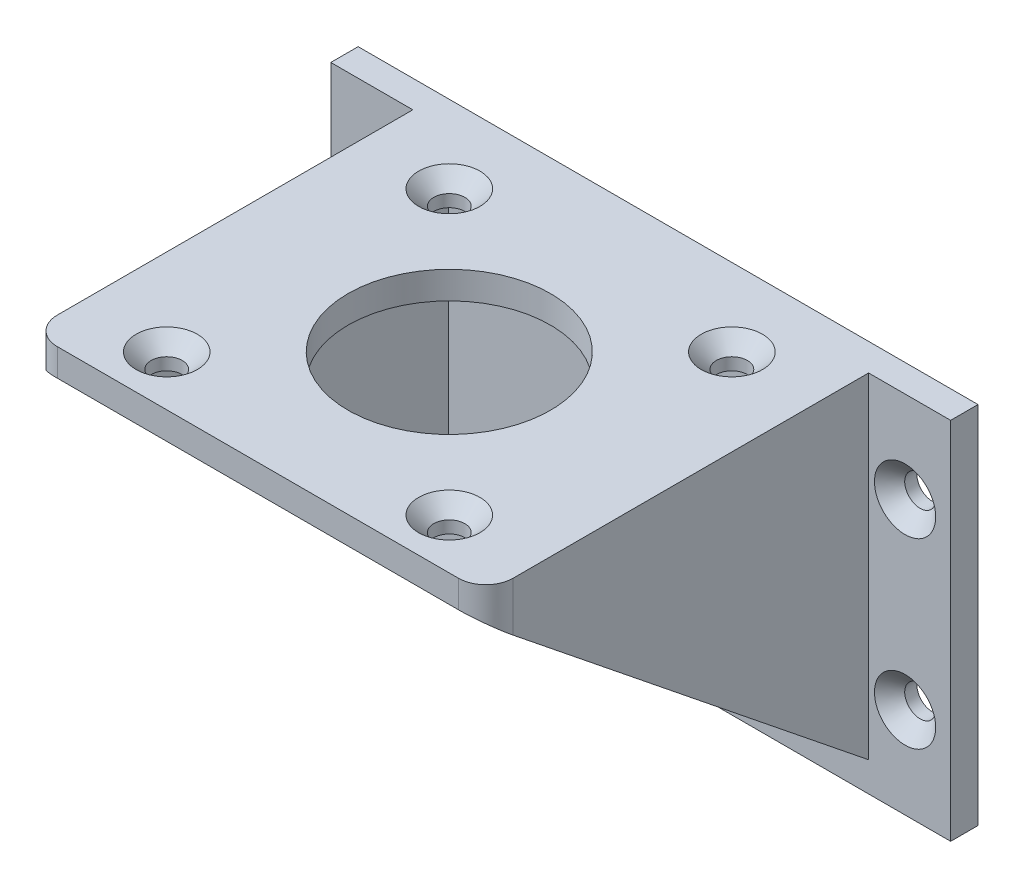
ISO-10303-21;
HEADER;
FILE_DESCRIPTION(('STEP AP214'),'2;1');
FILE_NAME('part.step','',(''),(''),'','','');
FILE_SCHEMA(('AUTOMOTIVE_DESIGN { 1 0 10303 214 1 1 1 1 }'));
ENDSEC;
DATA;
#1=APPLICATION_CONTEXT('core data for automotive mechanical design processes');
#2=APPLICATION_PROTOCOL_DEFINITION('international standard','automotive_design',2000,#1);
#3=PRODUCT_CONTEXT('',#1,'mechanical');
#4=PRODUCT('Part','Part','',(#3));
#5=PRODUCT_RELATED_PRODUCT_CATEGORY('part','',(#4));
#6=PRODUCT_DEFINITION_FORMATION('','',#4);
#7=PRODUCT_DEFINITION_CONTEXT('part definition',#1,'design');
#8=PRODUCT_DEFINITION('design','',#6,#7);
#9=PRODUCT_DEFINITION_SHAPE('','',#8);
#10=(LENGTH_UNIT() NAMED_UNIT(*) SI_UNIT(.MILLI.,.METRE.));
#11=(NAMED_UNIT(*) PLANE_ANGLE_UNIT() SI_UNIT($,.RADIAN.));
#12=(NAMED_UNIT(*) SI_UNIT($,.STERADIAN.) SOLID_ANGLE_UNIT());
#13=UNCERTAINTY_MEASURE_WITH_UNIT(LENGTH_MEASURE(1.E-05),#10,'distance_accuracy_value','');
#14=(GEOMETRIC_REPRESENTATION_CONTEXT(3) GLOBAL_UNCERTAINTY_ASSIGNED_CONTEXT((#13)) GLOBAL_UNIT_ASSIGNED_CONTEXT((#10,
#11,#12)) REPRESENTATION_CONTEXT('',''));
#15=CARTESIAN_POINT('',(0.,0.,0.));
#16=DIRECTION('',(0.,0.,1.));
#17=DIRECTION('',(1.,0.,0.));
#18=AXIS2_PLACEMENT_3D('',#15,#16,#17);
#19=CARTESIAN_POINT('',(78.8800751669854,-2.99999999999999,45.));
#20=DIRECTION('',(0.,-0.779508934793305,0.626391108316048));
#21=DIRECTION('',(0.,-0.626391108316048,-0.779508934793305));
#22=AXIS2_PLACEMENT_3D('',#19,#20,#21);
#23=PLANE('',#22);
#24=DIRECTION('',(0.,0.626391108316048,0.779508934793305));
#25=VECTOR('',#24,1.);
#26=CARTESIAN_POINT('',(25.,-2.99999999999999,45.));
#27=LINE('',#26,#25);
#28=CARTESIAN_POINT('',(25.,-36.75,3.));
#29=VERTEX_POINT('',#28);
#30=CARTESIAN_POINT('',(25.,-5.41071428571429,42.));
#31=VERTEX_POINT('',#30);
#32=EDGE_CURVE('E189',#29,#31,#27,.T.);
#33=ORIENTED_EDGE('',*,*,#32,.T.);
#34=CARTESIAN_POINT('',(22.,-5.41071428571429,42.));
#35=DIRECTION('',(0.,-0.779508934793305,0.626391108316048));
#36=DIRECTION('',(0.,0.626391108316048,0.779508934793305));
#37=AXIS2_PLACEMENT_3D('',#34,#35,#36);
#38=ELLIPSE('',#37,3.84857679764182,3.);
#39=CARTESIAN_POINT('',(22.,-3.,45.));
#40=VERTEX_POINT('',#39);
#41=EDGE_CURVE('E167',#31,#40,#38,.T.);
#42=ORIENTED_EDGE('',*,*,#41,.T.);
#43=DIRECTION('',(1.,0.,0.));
#44=VECTOR('',#43,1.);
#45=CARTESIAN_POINT('',(-25.,-3.,45.));
#46=LINE('',#45,#44);
#47=CARTESIAN_POINT('',(21.1,-2.99999999999999,45.));
#48=VERTEX_POINT('',#47);
#49=EDGE_CURVE('E163',#48,#40,#46,.T.);
#50=ORIENTED_EDGE('',*,*,#49,.F.);
#51=DIRECTION('',(0.,0.626391108316048,0.779508934793305));
#52=VECTOR('',#51,1.);
#53=CARTESIAN_POINT('',(21.1,-3.,45.));
#54=LINE('',#53,#52);
#55=CARTESIAN_POINT('',(21.1,-36.75,3.00000000000001));
#56=VERTEX_POINT('',#55);
#57=EDGE_CURVE('E136',#56,#48,#54,.T.);
#58=ORIENTED_EDGE('',*,*,#57,.F.);
#59=DIRECTION('',(-1.,0.,0.));
#60=VECTOR('',#59,1.);
#61=CARTESIAN_POINT('',(78.8800751669855,-36.75,3.00000000000001));
#62=LINE('',#61,#60);
#63=EDGE_CURVE('E195',#29,#56,#62,.T.);
#64=ORIENTED_EDGE('',*,*,#63,.F.);
#65=EDGE_LOOP('',(#33,#42,#50,#58,#64));
#66=FACE_BOUND('',#65,.T.);
#67=ADVANCED_FACE('F41',(#66),#23,.T.);
#68=CARTESIAN_POINT('',(0.,0.,3.));
#69=DIRECTION('',(0.,0.,1.));
#70=DIRECTION('',(1.,0.,0.));
#71=AXIS2_PLACEMENT_3D('',#68,#69,#70);
#72=PLANE('',#71);
#73=CARTESIAN_POINT('',(-29.,-30.,3.));
#74=DIRECTION('',(0.,0.,1.));
#75=DIRECTION('',(1.,0.,0.));
#76=AXIS2_PLACEMENT_3D('',#73,#74,#75);
#77=CIRCLE('',#76,3.36);
#78=CARTESIAN_POINT('',(-25.64,-30.,3.));
#79=VERTEX_POINT('',#78);
#80=EDGE_CURVE('E460',#79,#79,#77,.T.);
#81=ORIENTED_EDGE('',*,*,#80,.F.);
#82=EDGE_LOOP('',(#81));
#83=FACE_BOUND('',#82,.T.);
#84=CARTESIAN_POINT('',(29.,-9.99999999999999,3.));
#85=DIRECTION('',(0.,0.,1.));
#86=DIRECTION('',(1.,0.,0.));
#87=AXIS2_PLACEMENT_3D('',#84,#85,#86);
#88=CIRCLE('',#87,3.36);
#89=CARTESIAN_POINT('',(32.36,-9.99999999999999,3.));
#90=VERTEX_POINT('',#89);
#91=EDGE_CURVE('E464',#90,#90,#88,.T.);
#92=ORIENTED_EDGE('',*,*,#91,.F.);
#93=EDGE_LOOP('',(#92));
#94=FACE_BOUND('',#93,.T.);
#95=CARTESIAN_POINT('',(-29.,-9.99999999999999,3.));
#96=DIRECTION('',(0.,0.,1.));
#97=DIRECTION('',(1.,0.,0.));
#98=AXIS2_PLACEMENT_3D('',#95,#96,#97);
#99=CIRCLE('',#98,3.36);
#100=CARTESIAN_POINT('',(-25.64,-9.99999999999999,3.));
#101=VERTEX_POINT('',#100);
#102=EDGE_CURVE('E471',#101,#101,#99,.T.);
#103=ORIENTED_EDGE('',*,*,#102,.F.);
#104=EDGE_LOOP('',(#103));
#105=FACE_BOUND('',#104,.T.);
#106=CARTESIAN_POINT('',(29.,-30.,3.));
#107=DIRECTION('',(0.,0.,1.));
#108=DIRECTION('',(1.,0.,0.));
#109=AXIS2_PLACEMENT_3D('',#106,#107,#108);
#110=CIRCLE('',#109,3.36);
#111=CARTESIAN_POINT('',(32.36,-30.,3.));
#112=VERTEX_POINT('',#111);
#113=EDGE_CURVE('E485',#112,#112,#110,.T.);
#114=ORIENTED_EDGE('',*,*,#113,.F.);
#115=EDGE_LOOP('',(#114));
#116=FACE_BOUND('',#115,.T.);
#117=DIRECTION('',(1.,0.,0.));
#118=VECTOR('',#117,1.);
#119=CARTESIAN_POINT('',(-34.,-40.,3.));
#120=LINE('',#119,#118);
#121=CARTESIAN_POINT('',(-34.,-40.,3.));
#122=VERTEX_POINT('',#121);
#123=CARTESIAN_POINT('',(34.,-40.,3.));
#124=VERTEX_POINT('',#123);
#125=EDGE_CURVE('E249',#122,#124,#120,.T.);
#126=ORIENTED_EDGE('',*,*,#125,.T.);
#127=DIRECTION('',(0.,1.,0.));
#128=VECTOR('',#127,1.);
#129=CARTESIAN_POINT('',(34.,0.,3.));
#130=LINE('',#129,#128);
#131=CARTESIAN_POINT('',(34.,0.,3.));
#132=VERTEX_POINT('',#131);
#133=EDGE_CURVE('E251',#124,#132,#130,.T.);
#134=ORIENTED_EDGE('',*,*,#133,.T.);
#135=DIRECTION('',(-1.,0.,0.));
#136=VECTOR('',#135,1.);
#137=CARTESIAN_POINT('',(-34.,0.,3.));
#138=LINE('',#137,#136);
#139=CARTESIAN_POINT('',(25.,0.,3.));
#140=VERTEX_POINT('',#139);
#141=EDGE_CURVE('E258',#132,#140,#138,.T.);
#142=ORIENTED_EDGE('',*,*,#141,.T.);
#143=DIRECTION('',(0.,1.,0.));
#144=VECTOR('',#143,1.);
#145=CARTESIAN_POINT('',(25.,-3.,3.));
#146=LINE('',#145,#144);
#147=EDGE_CURVE('E232',#29,#140,#146,.T.);
#148=ORIENTED_EDGE('',*,*,#147,.F.);
#149=ORIENTED_EDGE('',*,*,#63,.T.);
#150=DIRECTION('',(0.,-1.,0.));
#151=VECTOR('',#150,1.);
#152=CARTESIAN_POINT('',(21.1,-2.99999999999999,3.));
#153=LINE('',#152,#151);
#154=CARTESIAN_POINT('',(21.1,-2.99999999999999,3.));
#155=VERTEX_POINT('',#154);
#156=EDGE_CURVE('E141',#155,#56,#153,.T.);
#157=ORIENTED_EDGE('',*,*,#156,.F.);
#158=DIRECTION('',(1.,0.,0.));
#159=VECTOR('',#158,1.);
#160=CARTESIAN_POINT('',(-21.1,-3.,3.));
#161=LINE('',#160,#159);
#162=CARTESIAN_POINT('',(-21.1,-3.,3.));
#163=VERTEX_POINT('',#162);
#164=EDGE_CURVE('E159',#163,#155,#161,.T.);
#165=ORIENTED_EDGE('',*,*,#164,.F.);
#166=DIRECTION('',(0.,-1.,0.));
#167=VECTOR('',#166,1.);
#168=CARTESIAN_POINT('',(-21.1,-3.,3.));
#169=LINE('',#168,#167);
#170=CARTESIAN_POINT('',(-21.1,-36.75,3.));
#171=VERTEX_POINT('',#170);
#172=EDGE_CURVE('E179',#163,#171,#169,.T.);
#173=ORIENTED_EDGE('',*,*,#172,.T.);
#174=CARTESIAN_POINT('',(-25.,-36.75,3.));
#175=VERTEX_POINT('',#174);
#176=EDGE_CURVE('E190',#171,#175,#62,.T.);
#177=ORIENTED_EDGE('',*,*,#176,.T.);
#178=DIRECTION('',(0.,1.,0.));
#179=VECTOR('',#178,1.);
#180=CARTESIAN_POINT('',(-25.,-3.,3.));
#181=LINE('',#180,#179);
#182=CARTESIAN_POINT('',(-25.,0.,3.));
#183=VERTEX_POINT('',#182);
#184=EDGE_CURVE('E242',#175,#183,#181,.T.);
#185=ORIENTED_EDGE('',*,*,#184,.T.);
#186=CARTESIAN_POINT('',(-34.,0.,3.));
#187=VERTEX_POINT('',#186);
#188=EDGE_CURVE('E254',#183,#187,#138,.T.);
#189=ORIENTED_EDGE('',*,*,#188,.T.);
#190=DIRECTION('',(0.,-1.,0.));
#191=VECTOR('',#190,1.);
#192=CARTESIAN_POINT('',(-34.,0.,3.));
#193=LINE('',#192,#191);
#194=EDGE_CURVE('E250',#187,#122,#193,.T.);
#195=ORIENTED_EDGE('',*,*,#194,.T.);
#196=EDGE_LOOP('',(#126,#134,#142,#148,#149,#157,#165,#173,#177,#185,#189,#195));
#197=FACE_BOUND('',#196,.T.);
#198=ADVANCED_FACE('F303',(#83,#94,#105,#116,#197),#72,.T.);
#199=CARTESIAN_POINT('',(-34.,0.,3.));
#200=DIRECTION('',(0.,-1.,0.));
#201=DIRECTION('',(1.,0.,0.));
#202=AXIS2_PLACEMENT_3D('',#199,#200,#201);
#203=PLANE('',#202);
#204=CARTESIAN_POINT('',(0.,0.,24.));
#205=DIRECTION('',(0.,1.,0.));
#206=DIRECTION('',(-1.,0.,0.));
#207=AXIS2_PLACEMENT_3D('',#204,#205,#206);
#208=CIRCLE('',#207,11.1);
#209=CARTESIAN_POINT('',(-11.1,0.,24.));
#210=VERTEX_POINT('',#209);
#211=EDGE_CURVE('E228',#210,#210,#208,.T.);
#212=ORIENTED_EDGE('',*,*,#211,.F.);
#213=EDGE_LOOP('',(#212));
#214=FACE_BOUND('',#213,.T.);
#215=DIRECTION('',(1.,0.,0.));
#216=VECTOR('',#215,1.);
#217=CARTESIAN_POINT('',(-25.,0.,45.));
#218=LINE('',#217,#216);
#219=CARTESIAN_POINT('',(-22.,0.,45.));
#220=VERTEX_POINT('',#219);
#221=CARTESIAN_POINT('',(22.,0.,45.));
#222=VERTEX_POINT('',#221);
#223=EDGE_CURVE('E240',#220,#222,#218,.T.);
#224=ORIENTED_EDGE('',*,*,#223,.T.);
#225=CARTESIAN_POINT('',(22.,0.,42.));
#226=DIRECTION('',(0.,-1.,0.));
#227=DIRECTION('',(1.,0.,0.));
#228=AXIS2_PLACEMENT_3D('',#225,#226,#227);
#229=CIRCLE('',#228,3.);
#230=CARTESIAN_POINT('',(25.,0.,42.));
#231=VERTEX_POINT('',#230);
#232=EDGE_CURVE('E284',#222,#231,#229,.F.);
#233=ORIENTED_EDGE('',*,*,#232,.T.);
#234=DIRECTION('',(0.,0.,-1.));
#235=VECTOR('',#234,1.);
#236=CARTESIAN_POINT('',(25.,0.,3.));
#237=LINE('',#236,#235);
#238=EDGE_CURVE('E172',#231,#140,#237,.T.);
#239=ORIENTED_EDGE('',*,*,#238,.T.);
#240=ORIENTED_EDGE('',*,*,#141,.F.);
#241=DIRECTION('',(0.,0.,-1.));
#242=VECTOR('',#241,1.);
#243=CARTESIAN_POINT('',(34.,0.,3.));
#244=LINE('',#243,#242);
#245=CARTESIAN_POINT('',(34.,0.,0.));
#246=VERTEX_POINT('',#245);
#247=EDGE_CURVE('E267',#132,#246,#244,.T.);
#248=ORIENTED_EDGE('',*,*,#247,.T.);
#249=DIRECTION('',(-1.,0.,0.));
#250=VECTOR('',#249,1.);
#251=CARTESIAN_POINT('',(-34.,0.,0.));
#252=LINE('',#251,#250);
#253=CARTESIAN_POINT('',(-34.,0.,0.));
#254=VERTEX_POINT('',#253);
#255=EDGE_CURVE('E253',#246,#254,#252,.T.);
#256=ORIENTED_EDGE('',*,*,#255,.T.);
#257=DIRECTION('',(0.,0.,-1.));
#258=VECTOR('',#257,1.);
#259=CARTESIAN_POINT('',(-34.,0.,3.));
#260=LINE('',#259,#258);
#261=EDGE_CURVE('E259',#187,#254,#260,.T.);
#262=ORIENTED_EDGE('',*,*,#261,.F.);
#263=ORIENTED_EDGE('',*,*,#188,.F.);
#264=DIRECTION('',(0.,0.,1.));
#265=VECTOR('',#264,1.);
#266=CARTESIAN_POINT('',(-25.,0.,3.));
#267=LINE('',#266,#265);
#268=CARTESIAN_POINT('',(-25.,0.,42.));
#269=VERTEX_POINT('',#268);
#270=EDGE_CURVE('E235',#183,#269,#267,.T.);
#271=ORIENTED_EDGE('',*,*,#270,.T.);
#272=CARTESIAN_POINT('',(-22.,0.,42.));
#273=DIRECTION('',(0.,-1.,0.));
#274=DIRECTION('',(1.,0.,0.));
#275=AXIS2_PLACEMENT_3D('',#272,#273,#274);
#276=CIRCLE('',#275,3.);
#277=EDGE_CURVE('E285',#269,#220,#276,.F.);
#278=ORIENTED_EDGE('',*,*,#277,.T.);
#279=EDGE_LOOP('',(#224,#233,#239,#240,#248,#256,#262,#263,#271,#278));
#280=FACE_BOUND('',#279,.T.);
#281=CARTESIAN_POINT('',(15.5,0.,39.5));
#282=DIRECTION('',(0.,1.,0.));
#283=DIRECTION('',(0.,0.,1.));
#284=AXIS2_PLACEMENT_3D('',#281,#282,#283);
#285=CIRCLE('',#284,3.36);
#286=CARTESIAN_POINT('',(15.5,0.,42.86));
#287=VERTEX_POINT('',#286);
#288=EDGE_CURVE('E219',#287,#287,#285,.T.);
#289=ORIENTED_EDGE('',*,*,#288,.F.);
#290=EDGE_LOOP('',(#289));
#291=FACE_BOUND('',#290,.T.);
#292=CARTESIAN_POINT('',(-15.5,0.,39.5));
#293=DIRECTION('',(0.,1.,0.));
#294=DIRECTION('',(0.,0.,1.));
#295=AXIS2_PLACEMENT_3D('',#292,#293,#294);
#296=CIRCLE('',#295,3.36);
#297=CARTESIAN_POINT('',(-15.5,0.,42.86));
#298=VERTEX_POINT('',#297);
#299=EDGE_CURVE('E211',#298,#298,#296,.T.);
#300=ORIENTED_EDGE('',*,*,#299,.F.);
#301=EDGE_LOOP('',(#300));
#302=FACE_BOUND('',#301,.T.);
#303=CARTESIAN_POINT('',(15.5,0.,8.5));
#304=DIRECTION('',(0.,1.,0.));
#305=DIRECTION('',(0.,0.,1.));
#306=AXIS2_PLACEMENT_3D('',#303,#304,#305);
#307=CIRCLE('',#306,3.36);
#308=CARTESIAN_POINT('',(15.5,0.,11.86));
#309=VERTEX_POINT('',#308);
#310=EDGE_CURVE('E205',#309,#309,#307,.T.);
#311=ORIENTED_EDGE('',*,*,#310,.F.);
#312=EDGE_LOOP('',(#311));
#313=FACE_BOUND('',#312,.T.);
#314=CARTESIAN_POINT('',(-15.5,0.,8.5));
#315=DIRECTION('',(0.,1.,0.));
#316=DIRECTION('',(0.,0.,1.));
#317=AXIS2_PLACEMENT_3D('',#314,#315,#316);
#318=CIRCLE('',#317,3.36);
#319=CARTESIAN_POINT('',(-15.5,0.,11.86));
#320=VERTEX_POINT('',#319);
#321=EDGE_CURVE('E193',#320,#320,#318,.T.);
#322=ORIENTED_EDGE('',*,*,#321,.F.);
#323=EDGE_LOOP('',(#322));
#324=FACE_BOUND('',#323,.T.);
#325=ADVANCED_FACE('F293',(#214,#280,#291,#302,#313,#324),#203,.F.);
#326=CARTESIAN_POINT('',(-34.,0.,3.));
#327=DIRECTION('',(1.,0.,0.));
#328=DIRECTION('',(0.,1.,0.));
#329=AXIS2_PLACEMENT_3D('',#326,#327,#328);
#330=PLANE('',#329);
#331=DIRECTION('',(0.,-1.,0.));
#332=VECTOR('',#331,1.);
#333=CARTESIAN_POINT('',(-34.,0.,0.));
#334=LINE('',#333,#332);
#335=CARTESIAN_POINT('',(-34.,-40.,0.));
#336=VERTEX_POINT('',#335);
#337=EDGE_CURVE('E244',#254,#336,#334,.T.);
#338=ORIENTED_EDGE('',*,*,#337,.T.);
#339=DIRECTION('',(0.,0.,-1.));
#340=VECTOR('',#339,1.);
#341=CARTESIAN_POINT('',(-34.,-40.,3.));
#342=LINE('',#341,#340);
#343=EDGE_CURVE('E274',#122,#336,#342,.T.);
#344=ORIENTED_EDGE('',*,*,#343,.F.);
#345=ORIENTED_EDGE('',*,*,#194,.F.);
#346=ORIENTED_EDGE('',*,*,#261,.T.);
#347=EDGE_LOOP('',(#338,#344,#345,#346));
#348=FACE_BOUND('',#347,.T.);
#349=ADVANCED_FACE('F325',(#348),#330,.F.);
#350=CARTESIAN_POINT('',(-34.,-40.,3.));
#351=DIRECTION('',(0.,1.,0.));
#352=DIRECTION('',(-1.,0.,0.));
#353=AXIS2_PLACEMENT_3D('',#350,#351,#352);
#354=PLANE('',#353);
#355=DIRECTION('',(1.,0.,0.));
#356=VECTOR('',#355,1.);
#357=CARTESIAN_POINT('',(-34.,-40.,0.));
#358=LINE('',#357,#356);
#359=CARTESIAN_POINT('',(34.,-40.,0.));
#360=VERTEX_POINT('',#359);
#361=EDGE_CURVE('E265',#336,#360,#358,.T.);
#362=ORIENTED_EDGE('',*,*,#361,.T.);
#363=DIRECTION('',(0.,0.,-1.));
#364=VECTOR('',#363,1.);
#365=CARTESIAN_POINT('',(34.,-40.,3.));
#366=LINE('',#365,#364);
#367=EDGE_CURVE('E275',#124,#360,#366,.T.);
#368=ORIENTED_EDGE('',*,*,#367,.F.);
#369=ORIENTED_EDGE('',*,*,#125,.F.);
#370=ORIENTED_EDGE('',*,*,#343,.T.);
#371=EDGE_LOOP('',(#362,#368,#369,#370));
#372=FACE_BOUND('',#371,.T.);
#373=ADVANCED_FACE('F322',(#372),#354,.F.);
#374=CARTESIAN_POINT('',(34.,0.,3.));
#375=DIRECTION('',(-1.,0.,0.));
#376=DIRECTION('',(0.,-1.,0.));
#377=AXIS2_PLACEMENT_3D('',#374,#375,#376);
#378=PLANE('',#377);
#379=DIRECTION('',(0.,1.,0.));
#380=VECTOR('',#379,1.);
#381=CARTESIAN_POINT('',(34.,0.,0.));
#382=LINE('',#381,#380);
#383=EDGE_CURVE('E262',#360,#246,#382,.T.);
#384=ORIENTED_EDGE('',*,*,#383,.T.);
#385=ORIENTED_EDGE('',*,*,#247,.F.);
#386=ORIENTED_EDGE('',*,*,#133,.F.);
#387=ORIENTED_EDGE('',*,*,#367,.T.);
#388=EDGE_LOOP('',(#384,#385,#386,#387));
#389=FACE_BOUND('',#388,.T.);
#390=ADVANCED_FACE('F326',(#389),#378,.F.);
#391=CARTESIAN_POINT('',(0.,0.,0.));
#392=DIRECTION('',(0.,0.,1.));
#393=DIRECTION('',(1.,0.,0.));
#394=AXIS2_PLACEMENT_3D('',#391,#392,#393);
#395=PLANE('',#394);
#396=CARTESIAN_POINT('',(-29.,-30.,0.));
#397=DIRECTION('',(0.,0.,1.));
#398=DIRECTION('',(1.,0.,0.));
#399=AXIS2_PLACEMENT_3D('',#396,#397,#398);
#400=CIRCLE('',#399,1.69999999999999);
#401=CARTESIAN_POINT('',(-27.3,-30.,0.));
#402=VERTEX_POINT('',#401);
#403=EDGE_CURVE('E459',#402,#402,#400,.T.);
#404=ORIENTED_EDGE('',*,*,#403,.T.);
#405=EDGE_LOOP('',(#404));
#406=FACE_BOUND('',#405,.T.);
#407=CARTESIAN_POINT('',(29.,-9.99999999999999,0.));
#408=DIRECTION('',(0.,0.,1.));
#409=DIRECTION('',(1.,0.,0.));
#410=AXIS2_PLACEMENT_3D('',#407,#408,#409);
#411=CIRCLE('',#410,1.69999999999999);
#412=CARTESIAN_POINT('',(30.7,-9.99999999999999,0.));
#413=VERTEX_POINT('',#412);
#414=EDGE_CURVE('E469',#413,#413,#411,.T.);
#415=ORIENTED_EDGE('',*,*,#414,.T.);
#416=EDGE_LOOP('',(#415));
#417=FACE_BOUND('',#416,.T.);
#418=CARTESIAN_POINT('',(-29.,-9.99999999999999,0.));
#419=DIRECTION('',(0.,0.,1.));
#420=DIRECTION('',(1.,0.,0.));
#421=AXIS2_PLACEMENT_3D('',#418,#419,#420);
#422=CIRCLE('',#421,1.69999999999999);
#423=CARTESIAN_POINT('',(-27.3,-9.99999999999999,0.));
#424=VERTEX_POINT('',#423);
#425=EDGE_CURVE('E479',#424,#424,#422,.T.);
#426=ORIENTED_EDGE('',*,*,#425,.T.);
#427=EDGE_LOOP('',(#426));
#428=FACE_BOUND('',#427,.T.);
#429=CARTESIAN_POINT('',(29.,-30.,0.));
#430=DIRECTION('',(0.,0.,1.));
#431=DIRECTION('',(1.,0.,0.));
#432=AXIS2_PLACEMENT_3D('',#429,#430,#431);
#433=CIRCLE('',#432,1.69999999999999);
#434=CARTESIAN_POINT('',(30.7,-30.,0.));
#435=VERTEX_POINT('',#434);
#436=EDGE_CURVE('E161',#435,#435,#433,.T.);
#437=ORIENTED_EDGE('',*,*,#436,.T.);
#438=EDGE_LOOP('',(#437));
#439=FACE_BOUND('',#438,.T.);
#440=ORIENTED_EDGE('',*,*,#337,.F.);
#441=ORIENTED_EDGE('',*,*,#255,.F.);
#442=ORIENTED_EDGE('',*,*,#383,.F.);
#443=ORIENTED_EDGE('',*,*,#361,.F.);
#444=EDGE_LOOP('',(#440,#441,#442,#443));
#445=FACE_BOUND('',#444,.T.);
#446=ADVANCED_FACE('F319',(#406,#417,#428,#439,#445),#395,.F.);
#447=CARTESIAN_POINT('',(-25.,-3.,3.));
#448=DIRECTION('',(-1.,0.,0.));
#449=DIRECTION('',(0.,-1.,0.));
#450=AXIS2_PLACEMENT_3D('',#447,#448,#449);
#451=PLANE('',#450);
#452=DIRECTION('',(0.,0.626391108316048,0.779508934793305));
#453=VECTOR('',#452,1.);
#454=CARTESIAN_POINT('',(-25.,-3.,45.));
#455=LINE('',#454,#453);
#456=CARTESIAN_POINT('',(-25.,-5.41071428571429,42.));
#457=VERTEX_POINT('',#456);
#458=EDGE_CURVE('E183',#175,#457,#455,.T.);
#459=ORIENTED_EDGE('',*,*,#458,.T.);
#460=DIRECTION('',(0.,1.,0.));
#461=VECTOR('',#460,1.);
#462=CARTESIAN_POINT('',(-25.,-3.,42.));
#463=LINE('',#462,#461);
#464=EDGE_CURVE('E47',#457,#269,#463,.T.);
#465=ORIENTED_EDGE('',*,*,#464,.T.);
#466=ORIENTED_EDGE('',*,*,#270,.F.);
#467=ORIENTED_EDGE('',*,*,#184,.F.);
#468=EDGE_LOOP('',(#459,#465,#466,#467));
#469=FACE_BOUND('',#468,.T.);
#470=ADVANCED_FACE('F289',(#469),#451,.T.);
#471=CARTESIAN_POINT('',(25.,-3.,3.));
#472=DIRECTION('',(1.,0.,0.));
#473=DIRECTION('',(0.,1.,0.));
#474=AXIS2_PLACEMENT_3D('',#471,#472,#473);
#475=PLANE('',#474);
#476=ORIENTED_EDGE('',*,*,#238,.F.);
#477=DIRECTION('',(0.,1.,0.));
#478=VECTOR('',#477,1.);
#479=CARTESIAN_POINT('',(25.,-3.,42.));
#480=LINE('',#479,#478);
#481=EDGE_CURVE('E65',#231,#31,#480,.F.);
#482=ORIENTED_EDGE('',*,*,#481,.T.);
#483=ORIENTED_EDGE('',*,*,#32,.F.);
#484=ORIENTED_EDGE('',*,*,#147,.T.);
#485=EDGE_LOOP('',(#476,#482,#483,#484));
#486=FACE_BOUND('',#485,.T.);
#487=ADVANCED_FACE('F315',(#486),#475,.T.);
#488=CARTESIAN_POINT('',(-25.,-3.,45.));
#489=DIRECTION('',(0.,0.,1.));
#490=DIRECTION('',(1.,0.,0.));
#491=AXIS2_PLACEMENT_3D('',#488,#489,#490);
#492=PLANE('',#491);
#493=ORIENTED_EDGE('',*,*,#49,.T.);
#494=DIRECTION('',(0.,1.,0.));
#495=VECTOR('',#494,1.);
#496=CARTESIAN_POINT('',(22.,-3.,45.));
#497=LINE('',#496,#495);
#498=EDGE_CURVE('E278',#40,#222,#497,.T.);
#499=ORIENTED_EDGE('',*,*,#498,.T.);
#500=ORIENTED_EDGE('',*,*,#223,.F.);
#501=DIRECTION('',(0.,1.,0.));
#502=VECTOR('',#501,1.);
#503=CARTESIAN_POINT('',(-22.,-3.,45.));
#504=LINE('',#503,#502);
#505=CARTESIAN_POINT('',(-22.,-3.,45.));
#506=VERTEX_POINT('',#505);
#507=EDGE_CURVE('E146',#220,#506,#504,.F.);
#508=ORIENTED_EDGE('',*,*,#507,.T.);
#509=CARTESIAN_POINT('',(-21.1,-3.,45.));
#510=VERTEX_POINT('',#509);
#511=EDGE_CURVE('E168',#506,#510,#46,.T.);
#512=ORIENTED_EDGE('',*,*,#511,.T.);
#513=DIRECTION('',(-1.,0.,0.));
#514=VECTOR('',#513,1.);
#515=CARTESIAN_POINT('',(-21.1,-3.,45.));
#516=LINE('',#515,#514);
#517=EDGE_CURVE('E160',#48,#510,#516,.T.);
#518=ORIENTED_EDGE('',*,*,#517,.F.);
#519=EDGE_LOOP('',(#493,#499,#500,#508,#512,#518));
#520=FACE_BOUND('',#519,.T.);
#521=ADVANCED_FACE('F173',(#520),#492,.T.);
#522=CARTESIAN_POINT('',(0.,-40.001,24.));
#523=DIRECTION('',(0.,1.,0.));
#524=DIRECTION('',(-1.,0.,0.));
#525=AXIS2_PLACEMENT_3D('',#522,#523,#524);
#526=CYLINDRICAL_SURFACE('',#525,11.1);
#527=ORIENTED_EDGE('',*,*,#211,.T.);
#528=EDGE_LOOP('',(#527));
#529=FACE_BOUND('',#528,.T.);
#530=CARTESIAN_POINT('',(0.,-3.,24.));
#531=DIRECTION('',(0.,1.,0.));
#532=DIRECTION('',(-1.,0.,0.));
#533=AXIS2_PLACEMENT_3D('',#530,#531,#532);
#534=CIRCLE('',#533,11.1);
#535=CARTESIAN_POINT('',(-11.1,-3.,24.));
#536=VERTEX_POINT('',#535);
#537=EDGE_CURVE('E185',#536,#536,#534,.F.);
#538=ORIENTED_EDGE('',*,*,#537,.T.);
#539=EDGE_LOOP('',(#538));
#540=FACE_BOUND('',#539,.T.);
#541=ADVANCED_FACE('F393',(#529,#540),#526,.F.);
#542=CARTESIAN_POINT('',(15.5,0.,39.5));
#543=DIRECTION('',(0.,1.,0.));
#544=DIRECTION('',(0.,0.,1.));
#545=AXIS2_PLACEMENT_3D('',#542,#543,#544);
#546=CYLINDRICAL_SURFACE('',#545,1.7);
#547=CARTESIAN_POINT('',(15.5,-3.,39.5));
#548=DIRECTION('',(0.,1.,0.));
#549=DIRECTION('',(-1.,0.,0.));
#550=AXIS2_PLACEMENT_3D('',#547,#548,#549);
#551=CIRCLE('',#550,1.7);
#552=CARTESIAN_POINT('',(13.8,-3.,39.5));
#553=VERTEX_POINT('',#552);
#554=EDGE_CURVE('E198',#553,#553,#551,.T.);
#555=ORIENTED_EDGE('',*,*,#554,.F.);
#556=EDGE_LOOP('',(#555));
#557=FACE_BOUND('',#556,.T.);
#558=CARTESIAN_POINT('',(15.5,-1.66,39.5));
#559=DIRECTION('',(0.,1.,0.));
#560=DIRECTION('',(0.,0.,1.));
#561=AXIS2_PLACEMENT_3D('',#558,#559,#560);
#562=CIRCLE('',#561,1.7);
#563=CARTESIAN_POINT('',(15.5,-1.66,41.2));
#564=VERTEX_POINT('',#563);
#565=EDGE_CURVE('E223',#564,#564,#562,.T.);
#566=ORIENTED_EDGE('',*,*,#565,.T.);
#567=EDGE_LOOP('',(#566));
#568=FACE_BOUND('',#567,.T.);
#569=ADVANCED_FACE('F386',(#557,#568),#546,.F.);
#570=CARTESIAN_POINT('',(15.5,0.,39.5));
#571=DIRECTION('',(0.,1.,0.));
#572=DIRECTION('',(0.,0.,1.));
#573=AXIS2_PLACEMENT_3D('',#570,#571,#572);
#574=CONICAL_SURFACE('',#573,3.36,0.785398163397449);
#575=ORIENTED_EDGE('',*,*,#565,.F.);
#576=EDGE_LOOP('',(#575));
#577=FACE_BOUND('',#576,.T.);
#578=ORIENTED_EDGE('',*,*,#288,.T.);
#579=EDGE_LOOP('',(#578));
#580=FACE_BOUND('',#579,.T.);
#581=ADVANCED_FACE('F384',(#577,#580),#574,.F.);
#582=CARTESIAN_POINT('',(-15.5,0.,39.5));
#583=DIRECTION('',(0.,1.,0.));
#584=DIRECTION('',(0.,0.,1.));
#585=AXIS2_PLACEMENT_3D('',#582,#583,#584);
#586=CYLINDRICAL_SURFACE('',#585,1.7);
#587=CARTESIAN_POINT('',(-15.5,-3.,39.5));
#588=DIRECTION('',(0.,1.,0.));
#589=DIRECTION('',(-1.,0.,0.));
#590=AXIS2_PLACEMENT_3D('',#587,#588,#589);
#591=CIRCLE('',#590,1.7);
#592=CARTESIAN_POINT('',(-17.2,-3.,39.5));
#593=VERTEX_POINT('',#592);
#594=EDGE_CURVE('E212',#593,#593,#591,.T.);
#595=ORIENTED_EDGE('',*,*,#594,.F.);
#596=EDGE_LOOP('',(#595));
#597=FACE_BOUND('',#596,.T.);
#598=CARTESIAN_POINT('',(-15.5,-1.66,39.5));
#599=DIRECTION('',(0.,1.,0.));
#600=DIRECTION('',(0.,0.,1.));
#601=AXIS2_PLACEMENT_3D('',#598,#599,#600);
#602=CIRCLE('',#601,1.7);
#603=CARTESIAN_POINT('',(-15.5,-1.66,41.2));
#604=VERTEX_POINT('',#603);
#605=EDGE_CURVE('E220',#604,#604,#602,.T.);
#606=ORIENTED_EDGE('',*,*,#605,.T.);
#607=EDGE_LOOP('',(#606));
#608=FACE_BOUND('',#607,.T.);
#609=ADVANCED_FACE('F381',(#597,#608),#586,.F.);
#610=CARTESIAN_POINT('',(-15.5,0.,39.5));
#611=DIRECTION('',(0.,1.,0.));
#612=DIRECTION('',(0.,0.,1.));
#613=AXIS2_PLACEMENT_3D('',#610,#611,#612);
#614=CONICAL_SURFACE('',#613,3.36,0.785398163397448);
#615=ORIENTED_EDGE('',*,*,#605,.F.);
#616=EDGE_LOOP('',(#615));
#617=FACE_BOUND('',#616,.T.);
#618=ORIENTED_EDGE('',*,*,#299,.T.);
#619=EDGE_LOOP('',(#618));
#620=FACE_BOUND('',#619,.T.);
#621=ADVANCED_FACE('F380',(#617,#620),#614,.F.);
#622=CARTESIAN_POINT('',(15.5,0.,8.5));
#623=DIRECTION('',(0.,1.,0.));
#624=DIRECTION('',(0.,0.,1.));
#625=AXIS2_PLACEMENT_3D('',#622,#623,#624);
#626=CYLINDRICAL_SURFACE('',#625,1.7);
#627=CARTESIAN_POINT('',(15.5,-3.,8.5));
#628=DIRECTION('',(0.,1.,0.));
#629=DIRECTION('',(-1.,0.,0.));
#630=AXIS2_PLACEMENT_3D('',#627,#628,#629);
#631=CIRCLE('',#630,1.7);
#632=CARTESIAN_POINT('',(13.8,-3.,8.5));
#633=VERTEX_POINT('',#632);
#634=EDGE_CURVE('E202',#633,#633,#631,.T.);
#635=ORIENTED_EDGE('',*,*,#634,.F.);
#636=EDGE_LOOP('',(#635));
#637=FACE_BOUND('',#636,.T.);
#638=CARTESIAN_POINT('',(15.5,-1.66,8.5));
#639=DIRECTION('',(0.,1.,0.));
#640=DIRECTION('',(0.,0.,1.));
#641=AXIS2_PLACEMENT_3D('',#638,#639,#640);
#642=CIRCLE('',#641,1.7);
#643=CARTESIAN_POINT('',(15.5,-1.66,10.2));
#644=VERTEX_POINT('',#643);
#645=EDGE_CURVE('E208',#644,#644,#642,.T.);
#646=ORIENTED_EDGE('',*,*,#645,.T.);
#647=EDGE_LOOP('',(#646));
#648=FACE_BOUND('',#647,.T.);
#649=ADVANCED_FACE('F373',(#637,#648),#626,.F.);
#650=CARTESIAN_POINT('',(15.5,0.,8.5));
#651=DIRECTION('',(0.,1.,0.));
#652=DIRECTION('',(0.,0.,1.));
#653=AXIS2_PLACEMENT_3D('',#650,#651,#652);
#654=CONICAL_SURFACE('',#653,3.36,0.785398163397449);
#655=ORIENTED_EDGE('',*,*,#645,.F.);
#656=EDGE_LOOP('',(#655));
#657=FACE_BOUND('',#656,.T.);
#658=ORIENTED_EDGE('',*,*,#310,.T.);
#659=EDGE_LOOP('',(#658));
#660=FACE_BOUND('',#659,.T.);
#661=ADVANCED_FACE('F364',(#657,#660),#654,.F.);
#662=CARTESIAN_POINT('',(-15.5,0.,8.5));
#663=DIRECTION('',(0.,1.,0.));
#664=DIRECTION('',(0.,0.,1.));
#665=AXIS2_PLACEMENT_3D('',#662,#663,#664);
#666=CYLINDRICAL_SURFACE('',#665,1.7);
#667=CARTESIAN_POINT('',(-15.5,-3.,8.5));
#668=DIRECTION('',(0.,1.,0.));
#669=DIRECTION('',(-1.,0.,0.));
#670=AXIS2_PLACEMENT_3D('',#667,#668,#669);
#671=CIRCLE('',#670,1.7);
#672=CARTESIAN_POINT('',(-17.2,-3.,8.5));
#673=VERTEX_POINT('',#672);
#674=EDGE_CURVE('E188',#673,#673,#671,.T.);
#675=ORIENTED_EDGE('',*,*,#674,.F.);
#676=EDGE_LOOP('',(#675));
#677=FACE_BOUND('',#676,.T.);
#678=CARTESIAN_POINT('',(-15.5,-1.66,8.5));
#679=DIRECTION('',(0.,1.,0.));
#680=DIRECTION('',(0.,0.,1.));
#681=AXIS2_PLACEMENT_3D('',#678,#679,#680);
#682=CIRCLE('',#681,1.7);
#683=CARTESIAN_POINT('',(-15.5,-1.66,10.2));
#684=VERTEX_POINT('',#683);
#685=EDGE_CURVE('E200',#684,#684,#682,.T.);
#686=ORIENTED_EDGE('',*,*,#685,.T.);
#687=EDGE_LOOP('',(#686));
#688=FACE_BOUND('',#687,.T.);
#689=ADVANCED_FACE('F359',(#677,#688),#666,.F.);
#690=CARTESIAN_POINT('',(-15.5,0.,8.5));
#691=DIRECTION('',(0.,1.,0.));
#692=DIRECTION('',(0.,0.,1.));
#693=AXIS2_PLACEMENT_3D('',#690,#691,#692);
#694=CONICAL_SURFACE('',#693,3.36,0.785398163397448);
#695=ORIENTED_EDGE('',*,*,#685,.F.);
#696=EDGE_LOOP('',(#695));
#697=FACE_BOUND('',#696,.T.);
#698=ORIENTED_EDGE('',*,*,#321,.T.);
#699=EDGE_LOOP('',(#698));
#700=FACE_BOUND('',#699,.T.);
#701=ADVANCED_FACE('F352',(#697,#700),#694,.F.);
#702=ORIENTED_EDGE('',*,*,#511,.F.);
#703=CARTESIAN_POINT('',(-22.,-5.41071428571429,42.));
#704=DIRECTION('',(0.,-0.779508934793305,0.626391108316048));
#705=DIRECTION('',(0.,0.626391108316048,0.779508934793305));
#706=AXIS2_PLACEMENT_3D('',#703,#704,#705);
#707=ELLIPSE('',#706,3.84857679764182,3.);
#708=EDGE_CURVE('E11',#506,#457,#707,.T.);
#709=ORIENTED_EDGE('',*,*,#708,.T.);
#710=ORIENTED_EDGE('',*,*,#458,.F.);
#711=ORIENTED_EDGE('',*,*,#176,.F.);
#712=DIRECTION('',(0.,-0.626391108316048,-0.779508934793305));
#713=VECTOR('',#712,1.);
#714=CARTESIAN_POINT('',(-21.1,-3.,45.));
#715=LINE('',#714,#713);
#716=EDGE_CURVE('E149',#510,#171,#715,.T.);
#717=ORIENTED_EDGE('',*,*,#716,.F.);
#718=EDGE_LOOP('',(#702,#709,#710,#711,#717));
#719=FACE_BOUND('',#718,.T.);
#720=ADVANCED_FACE('F302',(#719),#23,.T.);
#721=CARTESIAN_POINT('',(0.,-3.,0.));
#722=DIRECTION('',(0.,-1.,0.));
#723=DIRECTION('',(1.,0.,0.));
#724=AXIS2_PLACEMENT_3D('',#721,#722,#723);
#725=PLANE('',#724);
#726=ORIENTED_EDGE('',*,*,#537,.F.);
#727=EDGE_LOOP('',(#726));
#728=FACE_BOUND('',#727,.T.);
#729=DIRECTION('',(0.,0.,1.));
#730=VECTOR('',#729,1.);
#731=CARTESIAN_POINT('',(21.1,-2.99999999999999,45.));
#732=LINE('',#731,#730);
#733=EDGE_CURVE('E143',#155,#48,#732,.T.);
#734=ORIENTED_EDGE('',*,*,#733,.T.);
#735=ORIENTED_EDGE('',*,*,#517,.T.);
#736=DIRECTION('',(0.,0.,-1.));
#737=VECTOR('',#736,1.);
#738=CARTESIAN_POINT('',(-21.1,-3.,45.));
#739=LINE('',#738,#737);
#740=EDGE_CURVE('E174',#510,#163,#739,.T.);
#741=ORIENTED_EDGE('',*,*,#740,.T.);
#742=ORIENTED_EDGE('',*,*,#164,.T.);
#743=EDGE_LOOP('',(#734,#735,#741,#742));
#744=FACE_BOUND('',#743,.T.);
#745=ORIENTED_EDGE('',*,*,#554,.T.);
#746=EDGE_LOOP('',(#745));
#747=FACE_BOUND('',#746,.T.);
#748=ORIENTED_EDGE('',*,*,#594,.T.);
#749=EDGE_LOOP('',(#748));
#750=FACE_BOUND('',#749,.T.);
#751=ORIENTED_EDGE('',*,*,#634,.T.);
#752=EDGE_LOOP('',(#751));
#753=FACE_BOUND('',#752,.T.);
#754=ORIENTED_EDGE('',*,*,#674,.T.);
#755=EDGE_LOOP('',(#754));
#756=FACE_BOUND('',#755,.T.);
#757=ADVANCED_FACE('F153',(#728,#744,#747,#750,#753,#756),#725,.T.);
#758=CARTESIAN_POINT('',(21.1,-2.99999999999999,45.));
#759=DIRECTION('',(1.,0.,0.));
#760=DIRECTION('',(0.,1.,0.));
#761=AXIS2_PLACEMENT_3D('',#758,#759,#760);
#762=PLANE('',#761);
#763=ORIENTED_EDGE('',*,*,#57,.T.);
#764=ORIENTED_EDGE('',*,*,#733,.F.);
#765=ORIENTED_EDGE('',*,*,#156,.T.);
#766=EDGE_LOOP('',(#763,#764,#765));
#767=FACE_BOUND('',#766,.T.);
#768=ADVANCED_FACE('F139',(#767),#762,.F.);
#769=CARTESIAN_POINT('',(-21.1,-3.,45.));
#770=DIRECTION('',(-1.,0.,0.));
#771=DIRECTION('',(0.,-1.,0.));
#772=AXIS2_PLACEMENT_3D('',#769,#770,#771);
#773=PLANE('',#772);
#774=ORIENTED_EDGE('',*,*,#716,.T.);
#775=ORIENTED_EDGE('',*,*,#172,.F.);
#776=ORIENTED_EDGE('',*,*,#740,.F.);
#777=EDGE_LOOP('',(#774,#775,#776));
#778=FACE_BOUND('',#777,.T.);
#779=ADVANCED_FACE('F307',(#778),#773,.F.);
#780=CARTESIAN_POINT('',(22.,-3.,42.));
#781=DIRECTION('',(0.,1.,0.));
#782=DIRECTION('',(-1.,0.,0.));
#783=AXIS2_PLACEMENT_3D('',#780,#781,#782);
#784=CYLINDRICAL_SURFACE('',#783,3.);
#785=ORIENTED_EDGE('',*,*,#41,.F.);
#786=ORIENTED_EDGE('',*,*,#481,.F.);
#787=ORIENTED_EDGE('',*,*,#232,.F.);
#788=ORIENTED_EDGE('',*,*,#498,.F.);
#789=EDGE_LOOP('',(#785,#786,#787,#788));
#790=FACE_BOUND('',#789,.T.);
#791=ADVANCED_FACE('F310',(#790),#784,.T.);
#792=CARTESIAN_POINT('',(-22.,-3.,42.));
#793=DIRECTION('',(0.,1.,0.));
#794=DIRECTION('',(-1.,0.,0.));
#795=AXIS2_PLACEMENT_3D('',#792,#793,#794);
#796=CYLINDRICAL_SURFACE('',#795,3.);
#797=ORIENTED_EDGE('',*,*,#708,.F.);
#798=ORIENTED_EDGE('',*,*,#507,.F.);
#799=ORIENTED_EDGE('',*,*,#277,.F.);
#800=ORIENTED_EDGE('',*,*,#464,.F.);
#801=EDGE_LOOP('',(#797,#798,#799,#800));
#802=FACE_BOUND('',#801,.T.);
#803=ADVANCED_FACE('F43',(#802),#796,.T.);
#804=CARTESIAN_POINT('',(29.,-30.,3.));
#805=DIRECTION('',(0.,0.,1.));
#806=DIRECTION('',(1.,0.,0.));
#807=AXIS2_PLACEMENT_3D('',#804,#805,#806);
#808=CYLINDRICAL_SURFACE('',#807,1.69999999999999);
#809=ORIENTED_EDGE('',*,*,#436,.F.);
#810=EDGE_LOOP('',(#809));
#811=FACE_BOUND('',#810,.T.);
#812=CARTESIAN_POINT('',(29.,-30.,1.33999999999998));
#813=DIRECTION('',(0.,0.,1.));
#814=DIRECTION('',(1.,0.,0.));
#815=AXIS2_PLACEMENT_3D('',#812,#813,#814);
#816=CIRCLE('',#815,1.69999999999999);
#817=CARTESIAN_POINT('',(30.7,-30.,1.33999999999998));
#818=VERTEX_POINT('',#817);
#819=EDGE_CURVE('E484',#818,#818,#816,.T.);
#820=ORIENTED_EDGE('',*,*,#819,.T.);
#821=EDGE_LOOP('',(#820));
#822=FACE_BOUND('',#821,.T.);
#823=ADVANCED_FACE('F411',(#811,#822),#808,.F.);
#824=CARTESIAN_POINT('',(29.,-30.,3.));
#825=DIRECTION('',(0.,0.,1.));
#826=DIRECTION('',(1.,0.,0.));
#827=AXIS2_PLACEMENT_3D('',#824,#825,#826);
#828=CONICAL_SURFACE('',#827,3.36,0.785398163397444);
#829=ORIENTED_EDGE('',*,*,#819,.F.);
#830=EDGE_LOOP('',(#829));
#831=FACE_BOUND('',#830,.T.);
#832=ORIENTED_EDGE('',*,*,#113,.T.);
#833=EDGE_LOOP('',(#832));
#834=FACE_BOUND('',#833,.T.);
#835=ADVANCED_FACE('F423',(#831,#834),#828,.F.);
#836=CARTESIAN_POINT('',(-29.,-9.99999999999999,3.));
#837=DIRECTION('',(0.,0.,1.));
#838=DIRECTION('',(1.,0.,0.));
#839=AXIS2_PLACEMENT_3D('',#836,#837,#838);
#840=CYLINDRICAL_SURFACE('',#839,1.69999999999999);
#841=ORIENTED_EDGE('',*,*,#425,.F.);
#842=EDGE_LOOP('',(#841));
#843=FACE_BOUND('',#842,.T.);
#844=CARTESIAN_POINT('',(-29.,-9.99999999999999,1.33999999999998));
#845=DIRECTION('',(0.,0.,1.));
#846=DIRECTION('',(1.,0.,0.));
#847=AXIS2_PLACEMENT_3D('',#844,#845,#846);
#848=CIRCLE('',#847,1.69999999999999);
#849=CARTESIAN_POINT('',(-27.3,-9.99999999999999,1.33999999999998));
#850=VERTEX_POINT('',#849);
#851=EDGE_CURVE('E478',#850,#850,#848,.T.);
#852=ORIENTED_EDGE('',*,*,#851,.T.);
#853=EDGE_LOOP('',(#852));
#854=FACE_BOUND('',#853,.T.);
#855=ADVANCED_FACE('F422',(#843,#854),#840,.F.);
#856=CARTESIAN_POINT('',(-29.,-9.99999999999999,3.));
#857=DIRECTION('',(0.,0.,1.));
#858=DIRECTION('',(1.,0.,0.));
#859=AXIS2_PLACEMENT_3D('',#856,#857,#858);
#860=CONICAL_SURFACE('',#859,3.36,0.785398163397444);
#861=ORIENTED_EDGE('',*,*,#851,.F.);
#862=EDGE_LOOP('',(#861));
#863=FACE_BOUND('',#862,.T.);
#864=ORIENTED_EDGE('',*,*,#102,.T.);
#865=EDGE_LOOP('',(#864));
#866=FACE_BOUND('',#865,.T.);
#867=ADVANCED_FACE('F427',(#863,#866),#860,.F.);
#868=CARTESIAN_POINT('',(29.,-9.99999999999999,3.));
#869=DIRECTION('',(0.,0.,1.));
#870=DIRECTION('',(1.,0.,0.));
#871=AXIS2_PLACEMENT_3D('',#868,#869,#870);
#872=CYLINDRICAL_SURFACE('',#871,1.69999999999999);
#873=ORIENTED_EDGE('',*,*,#414,.F.);
#874=EDGE_LOOP('',(#873));
#875=FACE_BOUND('',#874,.T.);
#876=CARTESIAN_POINT('',(29.,-9.99999999999999,1.33999999999998));
#877=DIRECTION('',(0.,0.,1.));
#878=DIRECTION('',(1.,0.,0.));
#879=AXIS2_PLACEMENT_3D('',#876,#877,#878);
#880=CIRCLE('',#879,1.69999999999999);
#881=CARTESIAN_POINT('',(30.7,-9.99999999999999,1.33999999999998));
#882=VERTEX_POINT('',#881);
#883=EDGE_CURVE('E470',#882,#882,#880,.T.);
#884=ORIENTED_EDGE('',*,*,#883,.T.);
#885=EDGE_LOOP('',(#884));
#886=FACE_BOUND('',#885,.T.);
#887=ADVANCED_FACE('F433',(#875,#886),#872,.F.);
#888=CARTESIAN_POINT('',(29.,-9.99999999999999,3.));
#889=DIRECTION('',(0.,0.,1.));
#890=DIRECTION('',(1.,0.,0.));
#891=AXIS2_PLACEMENT_3D('',#888,#889,#890);
#892=CONICAL_SURFACE('',#891,3.36,0.785398163397444);
#893=ORIENTED_EDGE('',*,*,#883,.F.);
#894=EDGE_LOOP('',(#893));
#895=FACE_BOUND('',#894,.T.);
#896=ORIENTED_EDGE('',*,*,#91,.T.);
#897=EDGE_LOOP('',(#896));
#898=FACE_BOUND('',#897,.T.);
#899=ADVANCED_FACE('F440',(#895,#898),#892,.F.);
#900=CARTESIAN_POINT('',(-29.,-30.,3.));
#901=DIRECTION('',(0.,0.,1.));
#902=DIRECTION('',(1.,0.,0.));
#903=AXIS2_PLACEMENT_3D('',#900,#901,#902);
#904=CYLINDRICAL_SURFACE('',#903,1.69999999999999);
#905=ORIENTED_EDGE('',*,*,#403,.F.);
#906=EDGE_LOOP('',(#905));
#907=FACE_BOUND('',#906,.T.);
#908=CARTESIAN_POINT('',(-29.,-30.,1.33999999999998));
#909=DIRECTION('',(0.,0.,1.));
#910=DIRECTION('',(1.,0.,0.));
#911=AXIS2_PLACEMENT_3D('',#908,#909,#910);
#912=CIRCLE('',#911,1.69999999999999);
#913=CARTESIAN_POINT('',(-27.3,-30.,1.33999999999998));
#914=VERTEX_POINT('',#913);
#915=EDGE_CURVE('E452',#914,#914,#912,.T.);
#916=ORIENTED_EDGE('',*,*,#915,.T.);
#917=EDGE_LOOP('',(#916));
#918=FACE_BOUND('',#917,.T.);
#919=ADVANCED_FACE('F442',(#907,#918),#904,.F.);
#920=CARTESIAN_POINT('',(-29.,-30.,3.));
#921=DIRECTION('',(0.,0.,1.));
#922=DIRECTION('',(1.,0.,0.));
#923=AXIS2_PLACEMENT_3D('',#920,#921,#922);
#924=CONICAL_SURFACE('',#923,3.36,0.785398163397444);
#925=ORIENTED_EDGE('',*,*,#915,.F.);
#926=EDGE_LOOP('',(#925));
#927=FACE_BOUND('',#926,.T.);
#928=ORIENTED_EDGE('',*,*,#80,.T.);
#929=EDGE_LOOP('',(#928));
#930=FACE_BOUND('',#929,.T.);
#931=ADVANCED_FACE('F443',(#927,#930),#924,.F.);
#932=CLOSED_SHELL('',(#67,#198,#325,#349,#373,#390,#446,#470,#487,#521,#541,#569,#581,#609,#621,
#649,#661,#689,#701,#720,#757,#768,#779,#791,#803,#823,#835,#855,#867,#887,#899,#919,#931));
#933=MANIFOLD_SOLID_BREP('B2',#932);
#934=ADVANCED_BREP_SHAPE_REPRESENTATION('',(#18,#933),#14);
#935=SHAPE_DEFINITION_REPRESENTATION(#9,#934);
ENDSEC;
END-ISO-10303-21;
